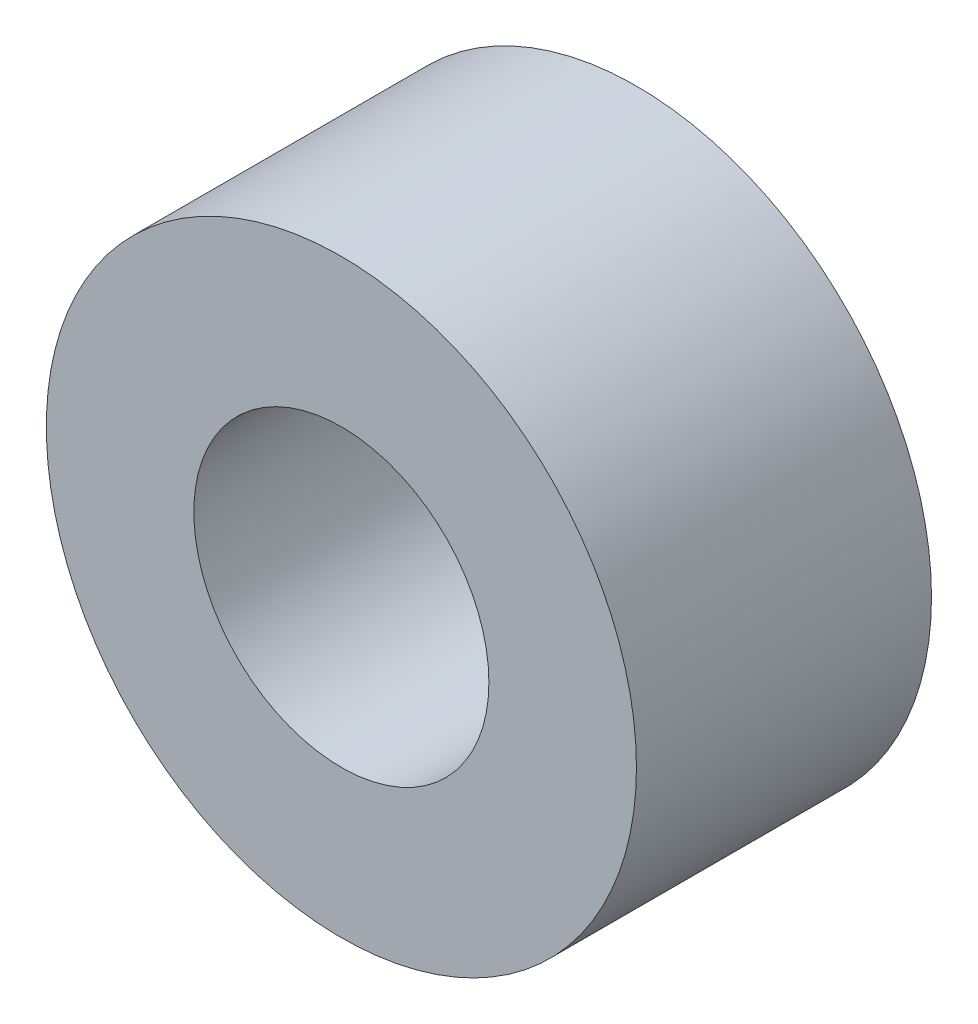
ISO-10303-21;
HEADER;
FILE_DESCRIPTION(('STEP AP214'),'2;1');
FILE_NAME('part.step','',(''),(''),'','','');
FILE_SCHEMA(('AUTOMOTIVE_DESIGN { 1 0 10303 214 1 1 1 1 }'));
ENDSEC;
DATA;
#1=APPLICATION_CONTEXT('core data for automotive mechanical design processes');
#2=APPLICATION_PROTOCOL_DEFINITION('international standard','automotive_design',2000,#1);
#3=PRODUCT_CONTEXT('',#1,'mechanical');
#4=PRODUCT('Part','Part','',(#3));
#5=PRODUCT_RELATED_PRODUCT_CATEGORY('part','',(#4));
#6=PRODUCT_DEFINITION_FORMATION('','',#4);
#7=PRODUCT_DEFINITION_CONTEXT('part definition',#1,'design');
#8=PRODUCT_DEFINITION('design','',#6,#7);
#9=PRODUCT_DEFINITION_SHAPE('','',#8);
#10=(LENGTH_UNIT() NAMED_UNIT(*) SI_UNIT(.MILLI.,.METRE.));
#11=(NAMED_UNIT(*) PLANE_ANGLE_UNIT() SI_UNIT($,.RADIAN.));
#12=(NAMED_UNIT(*) SI_UNIT($,.STERADIAN.) SOLID_ANGLE_UNIT());
#13=UNCERTAINTY_MEASURE_WITH_UNIT(LENGTH_MEASURE(1.E-05),#10,'distance_accuracy_value','');
#14=(GEOMETRIC_REPRESENTATION_CONTEXT(3) GLOBAL_UNCERTAINTY_ASSIGNED_CONTEXT((#13)) GLOBAL_UNIT_ASSIGNED_CONTEXT((#10,
#11,#12)) REPRESENTATION_CONTEXT('',''));
#15=CARTESIAN_POINT('',(0.,0.,0.));
#16=DIRECTION('',(0.,0.,1.));
#17=DIRECTION('',(1.,0.,0.));
#18=AXIS2_PLACEMENT_3D('',#15,#16,#17);
#19=CARTESIAN_POINT('',(0.,0.,3.175));
#20=DIRECTION('',(0.,0.,-1.));
#21=DIRECTION('',(-1.00000000000001,0.,0.));
#22=AXIS2_PLACEMENT_3D('',#19,#20,#21);
#23=CYLINDRICAL_SURFACE('',#22,1.5875);
#24=CARTESIAN_POINT('',(0.,0.,3.175));
#25=DIRECTION('',(0.,0.,1.));
#26=DIRECTION('',(1.00000000000001,0.,0.));
#27=AXIS2_PLACEMENT_3D('',#24,#25,#26);
#28=CIRCLE('',#27,1.5875);
#29=CARTESIAN_POINT('',(1.58750000000002,0.,3.175));
#30=VERTEX_POINT('',#29);
#31=EDGE_CURVE('E41',#30,#30,#28,.T.);
#32=ORIENTED_EDGE('',*,*,#31,.T.);
#33=EDGE_LOOP('',(#32));
#34=FACE_BOUND('',#33,.T.);
#35=CARTESIAN_POINT('',(0.,0.,0.));
#36=DIRECTION('',(0.,0.,1.));
#37=DIRECTION('',(1.00000000000001,0.,0.));
#38=AXIS2_PLACEMENT_3D('',#35,#36,#37);
#39=CIRCLE('',#38,1.5875);
#40=CARTESIAN_POINT('',(1.58750000000002,0.,0.));
#41=VERTEX_POINT('',#40);
#42=EDGE_CURVE('E47',#41,#41,#39,.T.);
#43=ORIENTED_EDGE('',*,*,#42,.F.);
#44=EDGE_LOOP('',(#43));
#45=FACE_BOUND('',#44,.T.);
#46=ADVANCED_FACE('F34',(#34,#45),#23,.F.);
#47=CARTESIAN_POINT('',(0.,0.,3.175));
#48=DIRECTION('',(0.,0.,-1.));
#49=DIRECTION('',(-1.00000000000001,0.,0.));
#50=AXIS2_PLACEMENT_3D('',#47,#48,#49);
#51=CYLINDRICAL_SURFACE('',#50,3.175);
#52=CARTESIAN_POINT('',(0.,0.,3.175));
#53=DIRECTION('',(0.,0.,1.));
#54=DIRECTION('',(1.00000000000001,0.,0.));
#55=AXIS2_PLACEMENT_3D('',#52,#53,#54);
#56=CIRCLE('',#55,3.175);
#57=CARTESIAN_POINT('',(3.17500000000004,0.,3.175));
#58=VERTEX_POINT('',#57);
#59=EDGE_CURVE('E10',#58,#58,#56,.T.);
#60=ORIENTED_EDGE('',*,*,#59,.F.);
#61=EDGE_LOOP('',(#60));
#62=FACE_BOUND('',#61,.T.);
#63=CARTESIAN_POINT('',(0.,0.,0.));
#64=DIRECTION('',(0.,0.,1.));
#65=DIRECTION('',(1.00000000000001,0.,0.));
#66=AXIS2_PLACEMENT_3D('',#63,#64,#65);
#67=CIRCLE('',#66,3.175);
#68=CARTESIAN_POINT('',(3.17500000000004,0.,0.));
#69=VERTEX_POINT('',#68);
#70=EDGE_CURVE('E37',#69,#69,#67,.T.);
#71=ORIENTED_EDGE('',*,*,#70,.T.);
#72=EDGE_LOOP('',(#71));
#73=FACE_BOUND('',#72,.T.);
#74=ADVANCED_FACE('F54',(#62,#73),#51,.T.);
#75=CARTESIAN_POINT('',(0.,0.,3.175));
#76=DIRECTION('',(0.,0.,1.));
#77=DIRECTION('',(1.00000000000001,0.,0.));
#78=AXIS2_PLACEMENT_3D('',#75,#76,#77);
#79=PLANE('',#78);
#80=ORIENTED_EDGE('',*,*,#31,.F.);
#81=EDGE_LOOP('',(#80));
#82=FACE_BOUND('',#81,.T.);
#83=ORIENTED_EDGE('',*,*,#59,.T.);
#84=EDGE_LOOP('',(#83));
#85=FACE_BOUND('',#84,.T.);
#86=ADVANCED_FACE('F58',(#82,#85),#79,.T.);
#87=CARTESIAN_POINT('',(0.,0.,0.));
#88=DIRECTION('',(0.,0.,1.));
#89=DIRECTION('',(1.00000000000001,0.,0.));
#90=AXIS2_PLACEMENT_3D('',#87,#88,#89);
#91=PLANE('',#90);
#92=ORIENTED_EDGE('',*,*,#42,.T.);
#93=EDGE_LOOP('',(#92));
#94=FACE_BOUND('',#93,.T.);
#95=ORIENTED_EDGE('',*,*,#70,.F.);
#96=EDGE_LOOP('',(#95));
#97=FACE_BOUND('',#96,.T.);
#98=ADVANCED_FACE('F56',(#94,#97),#91,.F.);
#99=CLOSED_SHELL('',(#46,#74,#86,#98));
#100=MANIFOLD_SOLID_BREP('B2',#99);
#101=ADVANCED_BREP_SHAPE_REPRESENTATION('',(#18,#100),#14);
#102=SHAPE_DEFINITION_REPRESENTATION(#9,#101);
ENDSEC;
END-ISO-10303-21;
